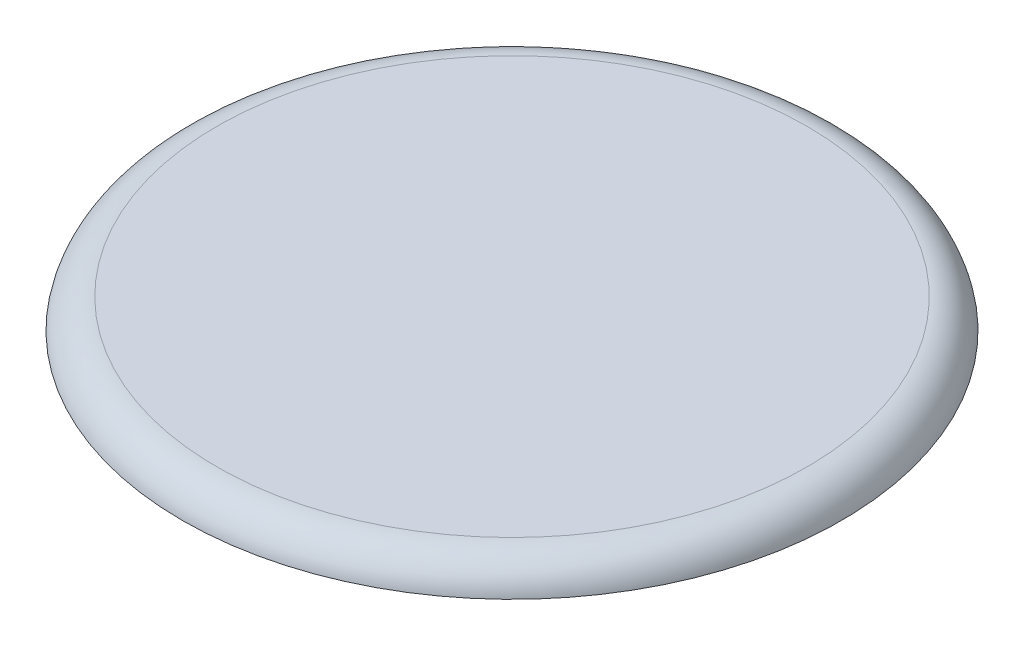
ISO-10303-21;
HEADER;
FILE_DESCRIPTION(('STEP AP214'),'2;1');
FILE_NAME('part.step','',(''),(''),'','','');
FILE_SCHEMA(('AUTOMOTIVE_DESIGN { 1 0 10303 214 1 1 1 1 }'));
ENDSEC;
DATA;
#1=APPLICATION_CONTEXT('core data for automotive mechanical design processes');
#2=APPLICATION_PROTOCOL_DEFINITION('international standard','automotive_design',2000,#1);
#3=PRODUCT_CONTEXT('',#1,'mechanical');
#4=PRODUCT('Part','Part','',(#3));
#5=PRODUCT_RELATED_PRODUCT_CATEGORY('part','',(#4));
#6=PRODUCT_DEFINITION_FORMATION('','',#4);
#7=PRODUCT_DEFINITION_CONTEXT('part definition',#1,'design');
#8=PRODUCT_DEFINITION('design','',#6,#7);
#9=PRODUCT_DEFINITION_SHAPE('','',#8);
#10=(LENGTH_UNIT() NAMED_UNIT(*) SI_UNIT(.MILLI.,.METRE.));
#11=(NAMED_UNIT(*) PLANE_ANGLE_UNIT() SI_UNIT($,.RADIAN.));
#12=(NAMED_UNIT(*) SI_UNIT($,.STERADIAN.) SOLID_ANGLE_UNIT());
#13=UNCERTAINTY_MEASURE_WITH_UNIT(LENGTH_MEASURE(1.E-05),#10,'distance_accuracy_value','');
#14=(GEOMETRIC_REPRESENTATION_CONTEXT(3) GLOBAL_UNCERTAINTY_ASSIGNED_CONTEXT((#13)) GLOBAL_UNIT_ASSIGNED_CONTEXT((#10,
#11,#12)) REPRESENTATION_CONTEXT('',''));
#15=CARTESIAN_POINT('',(0.,0.,0.));
#16=DIRECTION('',(0.,0.,1.));
#17=DIRECTION('',(1.,0.,0.));
#18=AXIS2_PLACEMENT_3D('',#15,#16,#17);
#19=CARTESIAN_POINT('',(0.,0.,0.));
#20=DIRECTION('',(0.,1.,0.));
#21=DIRECTION('',(0.,0.,1.));
#22=AXIS2_PLACEMENT_3D('',#19,#20,#21);
#23=PLANE('',#22);
#24=CARTESIAN_POINT('',(-51.9099999999985,0.,-1.47537093653227E-12));
#25=DIRECTION('',(0.,-1.,0.));
#26=DIRECTION('',(0.,0.,-1.));
#27=AXIS2_PLACEMENT_3D('',#24,#25,#26);
#28=CIRCLE('',#27,1.78500000000236);
#29=CARTESIAN_POINT('',(-51.9099999999985,0.,-1.78500000000383));
#30=VERTEX_POINT('',#29);
#31=EDGE_CURVE('E70',#30,#30,#28,.T.);
#32=ORIENTED_EDGE('',*,*,#31,.F.);
#33=EDGE_LOOP('',(#32));
#34=FACE_BOUND('',#33,.T.);
#35=CARTESIAN_POINT('',(2.9380275899958E-12,0.,-51.91));
#36=DIRECTION('',(0.,-1.,0.));
#37=DIRECTION('',(0.,0.,-1.));
#38=AXIS2_PLACEMENT_3D('',#35,#36,#37);
#39=CIRCLE('',#38,1.78500000000316);
#40=CARTESIAN_POINT('',(2.9380275899958E-12,0.,-53.6950000000032));
#41=VERTEX_POINT('',#40);
#42=EDGE_CURVE('E64',#41,#41,#39,.T.);
#43=ORIENTED_EDGE('',*,*,#42,.F.);
#44=EDGE_LOOP('',(#43));
#45=FACE_BOUND('',#44,.T.);
#46=CARTESIAN_POINT('',(51.9100000000015,0.,1.4690137949979E-12));
#47=DIRECTION('',(0.,-1.,0.));
#48=DIRECTION('',(0.,0.,-1.));
#49=AXIS2_PLACEMENT_3D('',#46,#47,#48);
#50=CIRCLE('',#49,1.78500000000115);
#51=CARTESIAN_POINT('',(51.9100000000015,0.,-1.78499999999968));
#52=VERTEX_POINT('',#51);
#53=EDGE_CURVE('E58',#52,#52,#50,.T.);
#54=ORIENTED_EDGE('',*,*,#53,.F.);
#55=EDGE_LOOP('',(#54));
#56=FACE_BOUND('',#55,.T.);
#57=CARTESIAN_POINT('',(0.,0.,51.91));
#58=DIRECTION('',(0.,-1.,0.));
#59=DIRECTION('',(0.,0.,-1.));
#60=AXIS2_PLACEMENT_3D('',#57,#58,#59);
#61=CIRCLE('',#60,1.785);
#62=CARTESIAN_POINT('',(0.,0.,50.125));
#63=VERTEX_POINT('',#62);
#64=EDGE_CURVE('E52',#63,#63,#61,.T.);
#65=ORIENTED_EDGE('',*,*,#64,.F.);
#66=EDGE_LOOP('',(#65));
#67=FACE_BOUND('',#66,.T.);
#68=CARTESIAN_POINT('',(0.,0.,0.));
#69=DIRECTION('',(0.,-1.,0.));
#70=DIRECTION('',(0.,0.,-1.));
#71=AXIS2_PLACEMENT_3D('',#68,#69,#70);
#72=CIRCLE('',#71,47.);
#73=CARTESIAN_POINT('',(0.,0.,-47.));
#74=VERTEX_POINT('',#73);
#75=EDGE_CURVE('E46',#74,#74,#72,.T.);
#76=ORIENTED_EDGE('',*,*,#75,.F.);
#77=EDGE_LOOP('',(#76));
#78=FACE_BOUND('',#77,.T.);
#79=CARTESIAN_POINT('',(0.,0.,0.));
#80=DIRECTION('',(0.,-1.,0.));
#81=DIRECTION('',(0.,0.,-1.));
#82=AXIS2_PLACEMENT_3D('',#79,#80,#81);
#83=CIRCLE('',#82,56.5);
#84=CARTESIAN_POINT('',(0.,0.,-56.5));
#85=VERTEX_POINT('',#84);
#86=EDGE_CURVE('E10',#85,#85,#83,.T.);
#87=ORIENTED_EDGE('',*,*,#86,.T.);
#88=EDGE_LOOP('',(#87));
#89=FACE_BOUND('',#88,.T.);
#90=ADVANCED_FACE('F32',(#34,#45,#56,#67,#78,#89),#23,.F.);
#91=CARTESIAN_POINT('',(0.,-1.,0.));
#92=DIRECTION('',(0.,-1.,0.));
#93=DIRECTION('',(0.,0.,-1.));
#94=AXIS2_PLACEMENT_3D('',#91,#92,#93);
#95=TOROIDAL_SURFACE('',#94,50.5839202169004,6.);
#96=CARTESIAN_POINT('',(0.,5.,0.));
#97=DIRECTION('',(0.,-1.,0.));
#98=DIRECTION('',(0.,0.,-1.));
#99=AXIS2_PLACEMENT_3D('',#96,#97,#98);
#100=CIRCLE('',#99,50.5839202169004);
#101=CARTESIAN_POINT('',(0.,5.,-50.5839202169004));
#102=VERTEX_POINT('',#101);
#103=EDGE_CURVE('E38',#102,#102,#100,.T.);
#104=ORIENTED_EDGE('',*,*,#103,.T.);
#105=EDGE_LOOP('',(#104));
#106=FACE_BOUND('',#105,.T.);
#107=ORIENTED_EDGE('',*,*,#86,.F.);
#108=EDGE_LOOP('',(#107));
#109=FACE_BOUND('',#108,.T.);
#110=ADVANCED_FACE('F87',(#106,#109),#95,.T.);
#111=CARTESIAN_POINT('',(0.,5.,0.));
#112=DIRECTION('',(0.,-1.,0.));
#113=DIRECTION('',(0.,0.,-1.));
#114=AXIS2_PLACEMENT_3D('',#111,#112,#113);
#115=PLANE('',#114);
#116=ORIENTED_EDGE('',*,*,#103,.F.);
#117=EDGE_LOOP('',(#116));
#118=FACE_BOUND('',#117,.T.);
#119=ADVANCED_FACE('F109',(#118),#115,.F.);
#120=CARTESIAN_POINT('',(0.,1.5,0.));
#121=DIRECTION('',(0.,1.,0.));
#122=DIRECTION('',(0.,0.,1.));
#123=AXIS2_PLACEMENT_3D('',#120,#121,#122);
#124=PLANE('',#123);
#125=CARTESIAN_POINT('',(0.,1.5,0.));
#126=DIRECTION('',(0.,-1.,0.));
#127=DIRECTION('',(0.,0.,-1.));
#128=AXIS2_PLACEMENT_3D('',#125,#126,#127);
#129=CIRCLE('',#128,47.);
#130=CARTESIAN_POINT('',(0.,1.5,-47.));
#131=VERTEX_POINT('',#130);
#132=EDGE_CURVE('E42',#131,#131,#129,.T.);
#133=ORIENTED_EDGE('',*,*,#132,.T.);
#134=EDGE_LOOP('',(#133));
#135=FACE_BOUND('',#134,.T.);
#136=ADVANCED_FACE('F99',(#135),#124,.F.);
#137=CARTESIAN_POINT('',(0.,0.,0.));
#138=DIRECTION('',(0.,-1.,0.));
#139=DIRECTION('',(0.,0.,-1.));
#140=AXIS2_PLACEMENT_3D('',#137,#138,#139);
#141=CYLINDRICAL_SURFACE('',#140,47.);
#142=ORIENTED_EDGE('',*,*,#132,.F.);
#143=EDGE_LOOP('',(#142));
#144=FACE_BOUND('',#143,.T.);
#145=ORIENTED_EDGE('',*,*,#75,.T.);
#146=EDGE_LOOP('',(#145));
#147=FACE_BOUND('',#146,.T.);
#148=ADVANCED_FACE('F96',(#144,#147),#141,.F.);
#149=CARTESIAN_POINT('',(0.,1.5,51.91));
#150=DIRECTION('',(0.,-1.,0.));
#151=DIRECTION('',(0.,0.,-1.));
#152=AXIS2_PLACEMENT_3D('',#149,#150,#151);
#153=CYLINDRICAL_SURFACE('',#152,1.785);
#154=CARTESIAN_POINT('',(0.,1.5,51.91));
#155=DIRECTION('',(0.,-1.,0.));
#156=DIRECTION('',(0.,0.,-1.));
#157=AXIS2_PLACEMENT_3D('',#154,#155,#156);
#158=CIRCLE('',#157,1.785);
#159=CARTESIAN_POINT('',(0.,1.5,50.125));
#160=VERTEX_POINT('',#159);
#161=EDGE_CURVE('E51',#160,#160,#158,.T.);
#162=ORIENTED_EDGE('',*,*,#161,.F.);
#163=EDGE_LOOP('',(#162));
#164=FACE_BOUND('',#163,.T.);
#165=ORIENTED_EDGE('',*,*,#64,.T.);
#166=EDGE_LOOP('',(#165));
#167=FACE_BOUND('',#166,.T.);
#168=ADVANCED_FACE('F98',(#164,#167),#153,.F.);
#169=CARTESIAN_POINT('',(0.,1.5,51.91));
#170=DIRECTION('',(0.,-1.,0.));
#171=DIRECTION('',(0.,0.,-1.));
#172=AXIS2_PLACEMENT_3D('',#169,#170,#171);
#173=PLANE('',#172);
#174=ORIENTED_EDGE('',*,*,#161,.T.);
#175=EDGE_LOOP('',(#174));
#176=FACE_BOUND('',#175,.T.);
#177=ADVANCED_FACE('F106',(#176),#173,.T.);
#178=CARTESIAN_POINT('',(51.9100000000015,1.5,1.4690137949979E-12));
#179=DIRECTION('',(0.,-1.,0.));
#180=DIRECTION('',(0.,0.,-1.));
#181=AXIS2_PLACEMENT_3D('',#178,#179,#180);
#182=CYLINDRICAL_SURFACE('',#181,1.78500000000115);
#183=CARTESIAN_POINT('',(51.9100000000015,1.5,1.4690137949979E-12));
#184=DIRECTION('',(0.,-1.,0.));
#185=DIRECTION('',(0.,0.,-1.));
#186=AXIS2_PLACEMENT_3D('',#183,#184,#185);
#187=CIRCLE('',#186,1.78500000000115);
#188=CARTESIAN_POINT('',(51.9100000000015,1.5,-1.78499999999968));
#189=VERTEX_POINT('',#188);
#190=EDGE_CURVE('E55',#189,#189,#187,.T.);
#191=ORIENTED_EDGE('',*,*,#190,.F.);
#192=EDGE_LOOP('',(#191));
#193=FACE_BOUND('',#192,.T.);
#194=ORIENTED_EDGE('',*,*,#53,.T.);
#195=EDGE_LOOP('',(#194));
#196=FACE_BOUND('',#195,.T.);
#197=ADVANCED_FACE('F154',(#193,#196),#182,.F.);
#198=CARTESIAN_POINT('',(51.9100000000015,1.5,1.4690137949979E-12));
#199=DIRECTION('',(0.,-1.,0.));
#200=DIRECTION('',(0.,0.,-1.));
#201=AXIS2_PLACEMENT_3D('',#198,#199,#200);
#202=PLANE('',#201);
#203=ORIENTED_EDGE('',*,*,#190,.T.);
#204=EDGE_LOOP('',(#203));
#205=FACE_BOUND('',#204,.T.);
#206=ADVANCED_FACE('F163',(#205),#202,.T.);
#207=CARTESIAN_POINT('',(2.9380275899958E-12,1.5,-51.91));
#208=DIRECTION('',(0.,-1.,0.));
#209=DIRECTION('',(0.,0.,-1.));
#210=AXIS2_PLACEMENT_3D('',#207,#208,#209);
#211=CYLINDRICAL_SURFACE('',#210,1.78500000000316);
#212=CARTESIAN_POINT('',(2.9380275899958E-12,1.5,-51.91));
#213=DIRECTION('',(0.,-1.,0.));
#214=DIRECTION('',(0.,0.,-1.));
#215=AXIS2_PLACEMENT_3D('',#212,#213,#214);
#216=CIRCLE('',#215,1.78500000000316);
#217=CARTESIAN_POINT('',(2.9380275899958E-12,1.5,-53.6950000000032));
#218=VERTEX_POINT('',#217);
#219=EDGE_CURVE('E61',#218,#218,#216,.T.);
#220=ORIENTED_EDGE('',*,*,#219,.F.);
#221=EDGE_LOOP('',(#220));
#222=FACE_BOUND('',#221,.T.);
#223=ORIENTED_EDGE('',*,*,#42,.T.);
#224=EDGE_LOOP('',(#223));
#225=FACE_BOUND('',#224,.T.);
#226=ADVANCED_FACE('F173',(#222,#225),#211,.F.);
#227=CARTESIAN_POINT('',(2.9380275899958E-12,1.5,-51.91));
#228=DIRECTION('',(0.,-1.,0.));
#229=DIRECTION('',(0.,0.,-1.));
#230=AXIS2_PLACEMENT_3D('',#227,#228,#229);
#231=PLANE('',#230);
#232=ORIENTED_EDGE('',*,*,#219,.T.);
#233=EDGE_LOOP('',(#232));
#234=FACE_BOUND('',#233,.T.);
#235=ADVANCED_FACE('F81',(#234),#231,.T.);
#236=CARTESIAN_POINT('',(-51.9099999999985,1.5,-1.47537093653227E-12));
#237=DIRECTION('',(0.,-1.,0.));
#238=DIRECTION('',(0.,0.,-1.));
#239=AXIS2_PLACEMENT_3D('',#236,#237,#238);
#240=CYLINDRICAL_SURFACE('',#239,1.78500000000236);
#241=CARTESIAN_POINT('',(-51.9099999999985,1.5,-1.47537093653227E-12));
#242=DIRECTION('',(0.,-1.,0.));
#243=DIRECTION('',(0.,0.,-1.));
#244=AXIS2_PLACEMENT_3D('',#241,#242,#243);
#245=CIRCLE('',#244,1.78500000000236);
#246=CARTESIAN_POINT('',(-51.9099999999985,1.5,-1.78500000000383));
#247=VERTEX_POINT('',#246);
#248=EDGE_CURVE('E67',#247,#247,#245,.T.);
#249=ORIENTED_EDGE('',*,*,#248,.F.);
#250=EDGE_LOOP('',(#249));
#251=FACE_BOUND('',#250,.T.);
#252=ORIENTED_EDGE('',*,*,#31,.T.);
#253=EDGE_LOOP('',(#252));
#254=FACE_BOUND('',#253,.T.);
#255=ADVANCED_FACE('F78',(#251,#254),#240,.F.);
#256=CARTESIAN_POINT('',(-51.9099999999985,1.5,-1.47537093653227E-12));
#257=DIRECTION('',(0.,-1.,0.));
#258=DIRECTION('',(0.,0.,-1.));
#259=AXIS2_PLACEMENT_3D('',#256,#257,#258);
#260=PLANE('',#259);
#261=ORIENTED_EDGE('',*,*,#248,.T.);
#262=EDGE_LOOP('',(#261));
#263=FACE_BOUND('',#262,.T.);
#264=ADVANCED_FACE('F76',(#263),#260,.T.);
#265=CLOSED_SHELL('',(#90,#110,#119,#136,#148,#168,#177,#197,#206,#226,#235,#255,#264));
#266=MANIFOLD_SOLID_BREP('B2',#265);
#267=ADVANCED_BREP_SHAPE_REPRESENTATION('',(#18,#266),#14);
#268=SHAPE_DEFINITION_REPRESENTATION(#9,#267);
ENDSEC;
END-ISO-10303-21;
